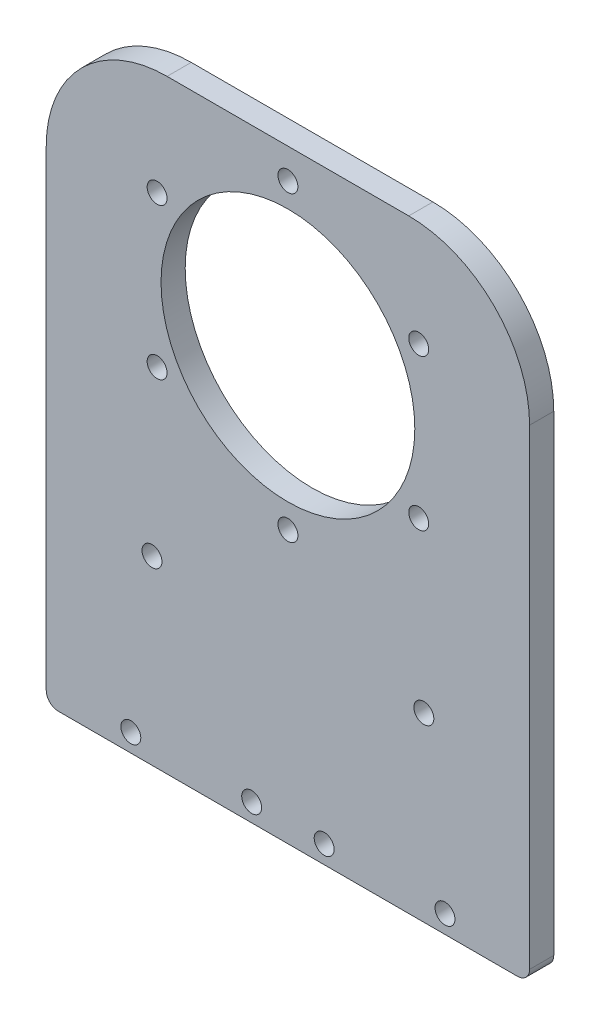
ISO-10303-21;
HEADER;
FILE_DESCRIPTION(('STEP AP214'),'2;1');
FILE_NAME('part.step','',(''),(''),'','','');
FILE_SCHEMA(('AUTOMOTIVE_DESIGN { 1 0 10303 214 1 1 1 1 }'));
ENDSEC;
DATA;
#1=APPLICATION_CONTEXT('core data for automotive mechanical design processes');
#2=APPLICATION_PROTOCOL_DEFINITION('international standard','automotive_design',2000,#1);
#3=PRODUCT_CONTEXT('',#1,'mechanical');
#4=PRODUCT('Part','Part','',(#3));
#5=PRODUCT_RELATED_PRODUCT_CATEGORY('part','',(#4));
#6=PRODUCT_DEFINITION_FORMATION('','',#4);
#7=PRODUCT_DEFINITION_CONTEXT('part definition',#1,'design');
#8=PRODUCT_DEFINITION('design','',#6,#7);
#9=PRODUCT_DEFINITION_SHAPE('','',#8);
#10=(LENGTH_UNIT() NAMED_UNIT(*) SI_UNIT(.MILLI.,.METRE.));
#11=(NAMED_UNIT(*) PLANE_ANGLE_UNIT() SI_UNIT($,.RADIAN.));
#12=(NAMED_UNIT(*) SI_UNIT($,.STERADIAN.) SOLID_ANGLE_UNIT());
#13=UNCERTAINTY_MEASURE_WITH_UNIT(LENGTH_MEASURE(1.E-05),#10,'distance_accuracy_value','');
#14=(GEOMETRIC_REPRESENTATION_CONTEXT(3) GLOBAL_UNCERTAINTY_ASSIGNED_CONTEXT((#13)) GLOBAL_UNIT_ASSIGNED_CONTEXT((#10,
#11,#12)) REPRESENTATION_CONTEXT('',''));
#15=CARTESIAN_POINT('',(0.,0.,0.));
#16=DIRECTION('',(0.,0.,1.));
#17=DIRECTION('',(1.,0.,0.));
#18=AXIS2_PLACEMENT_3D('',#15,#16,#17);
#19=CARTESIAN_POINT('',(0.,0.,4.));
#20=DIRECTION('',(0.,0.,1.));
#21=DIRECTION('',(1.,0.,0.));
#22=AXIS2_PLACEMENT_3D('',#19,#20,#21);
#23=PLANE('',#22);
#24=CARTESIAN_POINT('',(22.5,-20.,4.));
#25=DIRECTION('',(0.,0.,1.));
#26=DIRECTION('',(-1.,0.,0.));
#27=AXIS2_PLACEMENT_3D('',#24,#25,#26);
#28=CIRCLE('',#27,1.65);
#29=CARTESIAN_POINT('',(20.85,-20.,4.));
#30=VERTEX_POINT('',#29);
#31=EDGE_CURVE('E335',#30,#30,#28,.T.);
#32=ORIENTED_EDGE('',*,*,#31,.F.);
#33=EDGE_LOOP('',(#32));
#34=FACE_BOUND('',#33,.T.);
#35=CARTESIAN_POINT('',(-22.5,-20.,4.));
#36=DIRECTION('',(0.,0.,1.));
#37=DIRECTION('',(1.,0.,0.));
#38=AXIS2_PLACEMENT_3D('',#35,#36,#37);
#39=CIRCLE('',#38,1.65);
#40=CARTESIAN_POINT('',(-20.85,-20.,4.));
#41=VERTEX_POINT('',#40);
#42=EDGE_CURVE('E337',#41,#41,#39,.T.);
#43=ORIENTED_EDGE('',*,*,#42,.F.);
#44=EDGE_LOOP('',(#43));
#45=FACE_BOUND('',#44,.T.);
#46=CARTESIAN_POINT('',(-26.,-47.,4.));
#47=DIRECTION('',(0.,0.,1.));
#48=DIRECTION('',(1.,0.,0.));
#49=AXIS2_PLACEMENT_3D('',#46,#47,#48);
#50=CIRCLE('',#49,1.65);
#51=CARTESIAN_POINT('',(-24.35,-47.,4.));
#52=VERTEX_POINT('',#51);
#53=EDGE_CURVE('E358',#52,#52,#50,.T.);
#54=ORIENTED_EDGE('',*,*,#53,.F.);
#55=EDGE_LOOP('',(#54));
#56=FACE_BOUND('',#55,.T.);
#57=CARTESIAN_POINT('',(-6.00000000000001,-47.,4.));
#58=DIRECTION('',(0.,0.,1.));
#59=DIRECTION('',(-1.,0.,0.));
#60=AXIS2_PLACEMENT_3D('',#57,#58,#59);
#61=CIRCLE('',#60,1.65);
#62=CARTESIAN_POINT('',(-7.65000000000001,-47.,4.));
#63=VERTEX_POINT('',#62);
#64=EDGE_CURVE('E363',#63,#63,#61,.T.);
#65=ORIENTED_EDGE('',*,*,#64,.F.);
#66=EDGE_LOOP('',(#65));
#67=FACE_BOUND('',#66,.T.);
#68=CARTESIAN_POINT('',(6.00000000000001,-47.,4.));
#69=DIRECTION('',(0.,0.,1.));
#70=DIRECTION('',(1.,0.,0.));
#71=AXIS2_PLACEMENT_3D('',#68,#69,#70);
#72=CIRCLE('',#71,1.65);
#73=CARTESIAN_POINT('',(7.65000000000001,-47.,4.));
#74=VERTEX_POINT('',#73);
#75=EDGE_CURVE('E374',#74,#74,#72,.T.);
#76=ORIENTED_EDGE('',*,*,#75,.F.);
#77=EDGE_LOOP('',(#76));
#78=FACE_BOUND('',#77,.T.);
#79=CARTESIAN_POINT('',(26.,-47.,4.));
#80=DIRECTION('',(0.,0.,1.));
#81=DIRECTION('',(-1.,0.,0.));
#82=AXIS2_PLACEMENT_3D('',#79,#80,#81);
#83=CIRCLE('',#82,1.65);
#84=CARTESIAN_POINT('',(24.35,-47.,4.));
#85=VERTEX_POINT('',#84);
#86=EDGE_CURVE('E382',#85,#85,#83,.T.);
#87=ORIENTED_EDGE('',*,*,#86,.F.);
#88=EDGE_LOOP('',(#87));
#89=FACE_BOUND('',#88,.T.);
#90=CARTESIAN_POINT('',(0.,20.,4.));
#91=DIRECTION('',(0.,0.,1.));
#92=DIRECTION('',(1.,0.,0.));
#93=AXIS2_PLACEMENT_3D('',#90,#91,#92);
#94=CIRCLE('',#93,21.);
#95=CARTESIAN_POINT('',(21.,20.,4.));
#96=VERTEX_POINT('',#95);
#97=EDGE_CURVE('E357',#96,#96,#94,.T.);
#98=ORIENTED_EDGE('',*,*,#97,.F.);
#99=EDGE_LOOP('',(#98));
#100=FACE_BOUND('',#99,.T.);
#101=CARTESIAN_POINT('',(-21.650635094611,7.49999999999998,4.));
#102=DIRECTION('',(0.,0.,1.));
#103=DIRECTION('',(1.,0.,0.));
#104=AXIS2_PLACEMENT_3D('',#101,#102,#103);
#105=CIRCLE('',#104,1.65);
#106=CARTESIAN_POINT('',(-20.000635094611,7.49999999999998,4.));
#107=VERTEX_POINT('',#106);
#108=EDGE_CURVE('E403',#107,#107,#105,.T.);
#109=ORIENTED_EDGE('',*,*,#108,.F.);
#110=EDGE_LOOP('',(#109));
#111=FACE_BOUND('',#110,.T.);
#112=CARTESIAN_POINT('',(21.650635094611,7.49999999999999,4.));
#113=DIRECTION('',(0.,0.,1.));
#114=DIRECTION('',(1.,0.,0.));
#115=AXIS2_PLACEMENT_3D('',#112,#113,#114);
#116=CIRCLE('',#115,1.65);
#117=CARTESIAN_POINT('',(23.300635094611,7.49999999999999,4.));
#118=VERTEX_POINT('',#117);
#119=EDGE_CURVE('E194',#118,#118,#116,.T.);
#120=ORIENTED_EDGE('',*,*,#119,.F.);
#121=EDGE_LOOP('',(#120));
#122=FACE_BOUND('',#121,.T.);
#123=CARTESIAN_POINT('',(0.,45.,4.));
#124=DIRECTION('',(0.,0.,1.));
#125=DIRECTION('',(1.,0.,0.));
#126=AXIS2_PLACEMENT_3D('',#123,#124,#125);
#127=CIRCLE('',#126,1.65);
#128=CARTESIAN_POINT('',(1.65,45.,4.));
#129=VERTEX_POINT('',#128);
#130=EDGE_CURVE('E141',#129,#129,#127,.T.);
#131=ORIENTED_EDGE('',*,*,#130,.F.);
#132=EDGE_LOOP('',(#131));
#133=FACE_BOUND('',#132,.T.);
#134=DIRECTION('',(0.,1.,0.));
#135=VECTOR('',#134,1.);
#136=CARTESIAN_POINT('',(40.,50.,4.));
#137=LINE('',#136,#135);
#138=CARTESIAN_POINT('',(40.,-48.,4.));
#139=VERTEX_POINT('',#138);
#140=CARTESIAN_POINT('',(40.,30.,4.));
#141=VERTEX_POINT('',#140);
#142=EDGE_CURVE('E131',#139,#141,#137,.T.);
#143=ORIENTED_EDGE('',*,*,#142,.T.);
#144=CARTESIAN_POINT('',(20.,30.,4.));
#145=DIRECTION('',(0.,0.,1.));
#146=DIRECTION('',(1.,0.,0.));
#147=AXIS2_PLACEMENT_3D('',#144,#145,#146);
#148=CIRCLE('',#147,20.);
#149=CARTESIAN_POINT('',(20.,50.,4.));
#150=VERTEX_POINT('',#149);
#151=EDGE_CURVE('E55',#141,#150,#148,.T.);
#152=ORIENTED_EDGE('',*,*,#151,.T.);
#153=DIRECTION('',(-1.,0.,0.));
#154=VECTOR('',#153,1.);
#155=CARTESIAN_POINT('',(-40.,50.,4.));
#156=LINE('',#155,#154);
#157=CARTESIAN_POINT('',(-20.,50.,4.));
#158=VERTEX_POINT('',#157);
#159=EDGE_CURVE('E207',#150,#158,#156,.T.);
#160=ORIENTED_EDGE('',*,*,#159,.T.);
#161=CARTESIAN_POINT('',(-20.,30.,4.));
#162=DIRECTION('',(0.,0.,1.));
#163=DIRECTION('',(1.,0.,0.));
#164=AXIS2_PLACEMENT_3D('',#161,#162,#163);
#165=CIRCLE('',#164,20.);
#166=CARTESIAN_POINT('',(-40.,30.,4.));
#167=VERTEX_POINT('',#166);
#168=EDGE_CURVE('E62',#158,#167,#165,.T.);
#169=ORIENTED_EDGE('',*,*,#168,.T.);
#170=DIRECTION('',(0.,-1.,0.));
#171=VECTOR('',#170,1.);
#172=CARTESIAN_POINT('',(-40.,50.,4.));
#173=LINE('',#172,#171);
#174=CARTESIAN_POINT('',(-40.,-48.,4.));
#175=VERTEX_POINT('',#174);
#176=EDGE_CURVE('E210',#167,#175,#173,.T.);
#177=ORIENTED_EDGE('',*,*,#176,.T.);
#178=CARTESIAN_POINT('',(-38.,-48.,4.));
#179=DIRECTION('',(0.,0.,1.));
#180=DIRECTION('',(1.,0.,0.));
#181=AXIS2_PLACEMENT_3D('',#178,#179,#180);
#182=CIRCLE('',#181,2.);
#183=CARTESIAN_POINT('',(-38.,-50.,4.));
#184=VERTEX_POINT('',#183);
#185=EDGE_CURVE('E168',#175,#184,#182,.T.);
#186=ORIENTED_EDGE('',*,*,#185,.T.);
#187=DIRECTION('',(1.,0.,0.));
#188=VECTOR('',#187,1.);
#189=CARTESIAN_POINT('',(-40.,-50.,4.));
#190=LINE('',#189,#188);
#191=CARTESIAN_POINT('',(38.,-50.,4.));
#192=VERTEX_POINT('',#191);
#193=EDGE_CURVE('E133',#184,#192,#190,.T.);
#194=ORIENTED_EDGE('',*,*,#193,.T.);
#195=CARTESIAN_POINT('',(38.,-48.,4.));
#196=DIRECTION('',(0.,0.,1.));
#197=DIRECTION('',(1.,0.,0.));
#198=AXIS2_PLACEMENT_3D('',#195,#196,#197);
#199=CIRCLE('',#198,2.);
#200=EDGE_CURVE('E172',#192,#139,#199,.T.);
#201=ORIENTED_EDGE('',*,*,#200,.T.);
#202=EDGE_LOOP('',(#143,#152,#160,#169,#177,#186,#194,#201));
#203=FACE_BOUND('',#202,.T.);
#204=CARTESIAN_POINT('',(21.650635094611,32.5,4.));
#205=DIRECTION('',(0.,0.,1.));
#206=DIRECTION('',(1.,0.,0.));
#207=AXIS2_PLACEMENT_3D('',#204,#205,#206);
#208=CIRCLE('',#207,1.65);
#209=CARTESIAN_POINT('',(23.300635094611,32.5,4.));
#210=VERTEX_POINT('',#209);
#211=EDGE_CURVE('E183',#210,#210,#208,.T.);
#212=ORIENTED_EDGE('',*,*,#211,.F.);
#213=EDGE_LOOP('',(#212));
#214=FACE_BOUND('',#213,.T.);
#215=CARTESIAN_POINT('',(0.,-5.00000000000001,4.));
#216=DIRECTION('',(0.,0.,1.));
#217=DIRECTION('',(1.,0.,0.));
#218=AXIS2_PLACEMENT_3D('',#215,#216,#217);
#219=CIRCLE('',#218,1.65);
#220=CARTESIAN_POINT('',(1.65,-5.00000000000001,4.));
#221=VERTEX_POINT('',#220);
#222=EDGE_CURVE('E412',#221,#221,#219,.T.);
#223=ORIENTED_EDGE('',*,*,#222,.F.);
#224=EDGE_LOOP('',(#223));
#225=FACE_BOUND('',#224,.T.);
#226=CARTESIAN_POINT('',(-21.650635094611,32.5,4.));
#227=DIRECTION('',(0.,0.,1.));
#228=DIRECTION('',(1.,0.,0.));
#229=AXIS2_PLACEMENT_3D('',#226,#227,#228);
#230=CIRCLE('',#229,1.65);
#231=CARTESIAN_POINT('',(-20.000635094611,32.5,4.));
#232=VERTEX_POINT('',#231);
#233=EDGE_CURVE('E399',#232,#232,#230,.T.);
#234=ORIENTED_EDGE('',*,*,#233,.F.);
#235=EDGE_LOOP('',(#234));
#236=FACE_BOUND('',#235,.T.);
#237=ADVANCED_FACE('F46',(#34,#45,#56,#67,#78,#89,#100,#111,#122,#133,#203,#214,#225,#236),#23,.T.);
#238=CARTESIAN_POINT('',(0.,0.,0.));
#239=DIRECTION('',(0.,0.,1.));
#240=DIRECTION('',(1.,0.,0.));
#241=AXIS2_PLACEMENT_3D('',#238,#239,#240);
#242=PLANE('',#241);
#243=CARTESIAN_POINT('',(22.5,-20.,0.));
#244=DIRECTION('',(0.,0.,1.));
#245=DIRECTION('',(-1.,0.,0.));
#246=AXIS2_PLACEMENT_3D('',#243,#244,#245);
#247=CIRCLE('',#246,1.65);
#248=CARTESIAN_POINT('',(20.85,-20.,0.));
#249=VERTEX_POINT('',#248);
#250=EDGE_CURVE('E333',#249,#249,#247,.T.);
#251=ORIENTED_EDGE('',*,*,#250,.T.);
#252=EDGE_LOOP('',(#251));
#253=FACE_BOUND('',#252,.T.);
#254=CARTESIAN_POINT('',(-22.5,-20.,0.));
#255=DIRECTION('',(0.,0.,1.));
#256=DIRECTION('',(1.,0.,0.));
#257=AXIS2_PLACEMENT_3D('',#254,#255,#256);
#258=CIRCLE('',#257,1.65);
#259=CARTESIAN_POINT('',(-20.85,-20.,0.));
#260=VERTEX_POINT('',#259);
#261=EDGE_CURVE('E342',#260,#260,#258,.T.);
#262=ORIENTED_EDGE('',*,*,#261,.T.);
#263=EDGE_LOOP('',(#262));
#264=FACE_BOUND('',#263,.T.);
#265=CARTESIAN_POINT('',(-26.,-47.,0.));
#266=DIRECTION('',(0.,0.,1.));
#267=DIRECTION('',(1.,0.,0.));
#268=AXIS2_PLACEMENT_3D('',#265,#266,#267);
#269=CIRCLE('',#268,1.65);
#270=CARTESIAN_POINT('',(-24.35,-47.,0.));
#271=VERTEX_POINT('',#270);
#272=EDGE_CURVE('E354',#271,#271,#269,.T.);
#273=ORIENTED_EDGE('',*,*,#272,.T.);
#274=EDGE_LOOP('',(#273));
#275=FACE_BOUND('',#274,.T.);
#276=CARTESIAN_POINT('',(-6.00000000000001,-47.,0.));
#277=DIRECTION('',(0.,0.,1.));
#278=DIRECTION('',(-1.,0.,0.));
#279=AXIS2_PLACEMENT_3D('',#276,#277,#278);
#280=CIRCLE('',#279,1.65);
#281=CARTESIAN_POINT('',(-7.65000000000001,-47.,0.));
#282=VERTEX_POINT('',#281);
#283=EDGE_CURVE('E368',#282,#282,#280,.T.);
#284=ORIENTED_EDGE('',*,*,#283,.T.);
#285=EDGE_LOOP('',(#284));
#286=FACE_BOUND('',#285,.T.);
#287=CARTESIAN_POINT('',(6.00000000000001,-47.,0.));
#288=DIRECTION('',(0.,0.,1.));
#289=DIRECTION('',(1.,0.,0.));
#290=AXIS2_PLACEMENT_3D('',#287,#288,#289);
#291=CIRCLE('',#290,1.65);
#292=CARTESIAN_POINT('',(7.65000000000001,-47.,0.));
#293=VERTEX_POINT('',#292);
#294=EDGE_CURVE('E379',#293,#293,#291,.T.);
#295=ORIENTED_EDGE('',*,*,#294,.T.);
#296=EDGE_LOOP('',(#295));
#297=FACE_BOUND('',#296,.T.);
#298=CARTESIAN_POINT('',(26.,-47.,0.));
#299=DIRECTION('',(0.,0.,1.));
#300=DIRECTION('',(-1.,0.,0.));
#301=AXIS2_PLACEMENT_3D('',#298,#299,#300);
#302=CIRCLE('',#301,1.65);
#303=CARTESIAN_POINT('',(24.35,-47.,0.));
#304=VERTEX_POINT('',#303);
#305=EDGE_CURVE('E387',#304,#304,#302,.T.);
#306=ORIENTED_EDGE('',*,*,#305,.T.);
#307=EDGE_LOOP('',(#306));
#308=FACE_BOUND('',#307,.T.);
#309=CARTESIAN_POINT('',(0.,20.,0.));
#310=DIRECTION('',(0.,0.,1.));
#311=DIRECTION('',(1.,0.,0.));
#312=AXIS2_PLACEMENT_3D('',#309,#310,#311);
#313=CIRCLE('',#312,21.);
#314=CARTESIAN_POINT('',(21.,20.,0.));
#315=VERTEX_POINT('',#314);
#316=EDGE_CURVE('E391',#315,#315,#313,.T.);
#317=ORIENTED_EDGE('',*,*,#316,.T.);
#318=EDGE_LOOP('',(#317));
#319=FACE_BOUND('',#318,.T.);
#320=DIRECTION('',(-1.,0.,0.));
#321=VECTOR('',#320,1.);
#322=CARTESIAN_POINT('',(-40.,50.,0.));
#323=LINE('',#322,#321);
#324=CARTESIAN_POINT('',(20.,50.,0.));
#325=VERTEX_POINT('',#324);
#326=CARTESIAN_POINT('',(-20.,50.,0.));
#327=VERTEX_POINT('',#326);
#328=EDGE_CURVE('E140',#325,#327,#323,.T.);
#329=ORIENTED_EDGE('',*,*,#328,.F.);
#330=CARTESIAN_POINT('',(20.,30.,0.));
#331=DIRECTION('',(0.,0.,1.));
#332=DIRECTION('',(1.,0.,0.));
#333=AXIS2_PLACEMENT_3D('',#330,#331,#332);
#334=CIRCLE('',#333,20.);
#335=CARTESIAN_POINT('',(40.,30.,0.));
#336=VERTEX_POINT('',#335);
#337=EDGE_CURVE('E138',#325,#336,#334,.F.);
#338=ORIENTED_EDGE('',*,*,#337,.T.);
#339=DIRECTION('',(0.,1.,0.));
#340=VECTOR('',#339,1.);
#341=CARTESIAN_POINT('',(40.,50.,0.));
#342=LINE('',#341,#340);
#343=CARTESIAN_POINT('',(40.,-48.,0.));
#344=VERTEX_POINT('',#343);
#345=EDGE_CURVE('E130',#344,#336,#342,.T.);
#346=ORIENTED_EDGE('',*,*,#345,.F.);
#347=CARTESIAN_POINT('',(38.,-48.,0.));
#348=DIRECTION('',(0.,0.,1.));
#349=DIRECTION('',(1.,0.,0.));
#350=AXIS2_PLACEMENT_3D('',#347,#348,#349);
#351=CIRCLE('',#350,2.);
#352=CARTESIAN_POINT('',(38.,-50.,0.));
#353=VERTEX_POINT('',#352);
#354=EDGE_CURVE('E115',#344,#353,#351,.F.);
#355=ORIENTED_EDGE('',*,*,#354,.T.);
#356=DIRECTION('',(1.,0.,0.));
#357=VECTOR('',#356,1.);
#358=CARTESIAN_POINT('',(-40.,-50.,0.));
#359=LINE('',#358,#357);
#360=CARTESIAN_POINT('',(-38.,-50.,0.));
#361=VERTEX_POINT('',#360);
#362=EDGE_CURVE('E157',#361,#353,#359,.T.);
#363=ORIENTED_EDGE('',*,*,#362,.F.);
#364=CARTESIAN_POINT('',(-38.,-48.,0.));
#365=DIRECTION('',(0.,0.,1.));
#366=DIRECTION('',(1.,0.,0.));
#367=AXIS2_PLACEMENT_3D('',#364,#365,#366);
#368=CIRCLE('',#367,2.);
#369=CARTESIAN_POINT('',(-40.,-48.,0.));
#370=VERTEX_POINT('',#369);
#371=EDGE_CURVE('E127',#361,#370,#368,.F.);
#372=ORIENTED_EDGE('',*,*,#371,.T.);
#373=DIRECTION('',(0.,-1.,0.));
#374=VECTOR('',#373,1.);
#375=CARTESIAN_POINT('',(-40.,50.,0.));
#376=LINE('',#375,#374);
#377=CARTESIAN_POINT('',(-40.,30.,0.));
#378=VERTEX_POINT('',#377);
#379=EDGE_CURVE('E146',#378,#370,#376,.T.);
#380=ORIENTED_EDGE('',*,*,#379,.F.);
#381=CARTESIAN_POINT('',(-20.,30.,0.));
#382=DIRECTION('',(0.,0.,1.));
#383=DIRECTION('',(1.,0.,0.));
#384=AXIS2_PLACEMENT_3D('',#381,#382,#383);
#385=CIRCLE('',#384,20.);
#386=EDGE_CURVE('E232',#378,#327,#385,.F.);
#387=ORIENTED_EDGE('',*,*,#386,.T.);
#388=EDGE_LOOP('',(#329,#338,#346,#355,#363,#372,#380,#387));
#389=FACE_BOUND('',#388,.T.);
#390=CARTESIAN_POINT('',(0.,45.,0.));
#391=DIRECTION('',(0.,0.,1.));
#392=DIRECTION('',(1.,0.,0.));
#393=AXIS2_PLACEMENT_3D('',#390,#391,#392);
#394=CIRCLE('',#393,1.65);
#395=CARTESIAN_POINT('',(1.65,45.,0.));
#396=VERTEX_POINT('',#395);
#397=EDGE_CURVE('E149',#396,#396,#394,.T.);
#398=ORIENTED_EDGE('',*,*,#397,.T.);
#399=EDGE_LOOP('',(#398));
#400=FACE_BOUND('',#399,.T.);
#401=CARTESIAN_POINT('',(21.650635094611,32.5,0.));
#402=DIRECTION('',(0.,0.,1.));
#403=DIRECTION('',(1.,0.,0.));
#404=AXIS2_PLACEMENT_3D('',#401,#402,#403);
#405=CIRCLE('',#404,1.65);
#406=CARTESIAN_POINT('',(23.300635094611,32.5,0.));
#407=VERTEX_POINT('',#406);
#408=EDGE_CURVE('E189',#407,#407,#405,.T.);
#409=ORIENTED_EDGE('',*,*,#408,.T.);
#410=EDGE_LOOP('',(#409));
#411=FACE_BOUND('',#410,.T.);
#412=CARTESIAN_POINT('',(21.650635094611,7.49999999999999,0.));
#413=DIRECTION('',(0.,0.,1.));
#414=DIRECTION('',(1.,0.,0.));
#415=AXIS2_PLACEMENT_3D('',#412,#413,#414);
#416=CIRCLE('',#415,1.65);
#417=CARTESIAN_POINT('',(23.300635094611,7.49999999999999,0.));
#418=VERTEX_POINT('',#417);
#419=EDGE_CURVE('E190',#418,#418,#416,.T.);
#420=ORIENTED_EDGE('',*,*,#419,.T.);
#421=EDGE_LOOP('',(#420));
#422=FACE_BOUND('',#421,.T.);
#423=CARTESIAN_POINT('',(0.,-5.00000000000001,0.));
#424=DIRECTION('',(0.,0.,1.));
#425=DIRECTION('',(1.,0.,0.));
#426=AXIS2_PLACEMENT_3D('',#423,#424,#425);
#427=CIRCLE('',#426,1.65);
#428=CARTESIAN_POINT('',(1.65,-5.00000000000001,0.));
#429=VERTEX_POINT('',#428);
#430=EDGE_CURVE('E408',#429,#429,#427,.T.);
#431=ORIENTED_EDGE('',*,*,#430,.T.);
#432=EDGE_LOOP('',(#431));
#433=FACE_BOUND('',#432,.T.);
#434=CARTESIAN_POINT('',(-21.650635094611,7.49999999999998,0.));
#435=DIRECTION('',(0.,0.,1.));
#436=DIRECTION('',(1.,0.,0.));
#437=AXIS2_PLACEMENT_3D('',#434,#435,#436);
#438=CIRCLE('',#437,1.65);
#439=CARTESIAN_POINT('',(-20.000635094611,7.49999999999998,0.));
#440=VERTEX_POINT('',#439);
#441=EDGE_CURVE('E409',#440,#440,#438,.T.);
#442=ORIENTED_EDGE('',*,*,#441,.T.);
#443=EDGE_LOOP('',(#442));
#444=FACE_BOUND('',#443,.T.);
#445=CARTESIAN_POINT('',(-21.650635094611,32.5,0.));
#446=DIRECTION('',(0.,0.,1.));
#447=DIRECTION('',(1.,0.,0.));
#448=AXIS2_PLACEMENT_3D('',#445,#446,#447);
#449=CIRCLE('',#448,1.65);
#450=CARTESIAN_POINT('',(-20.000635094611,32.5,0.));
#451=VERTEX_POINT('',#450);
#452=EDGE_CURVE('E395',#451,#451,#449,.T.);
#453=ORIENTED_EDGE('',*,*,#452,.T.);
#454=EDGE_LOOP('',(#453));
#455=FACE_BOUND('',#454,.T.);
#456=ADVANCED_FACE('F136',(#253,#264,#275,#286,#297,#308,#319,#389,#400,#411,#422,#433,#444,
#455),#242,.F.);
#457=CARTESIAN_POINT('',(40.,50.,4.));
#458=DIRECTION('',(-1.,0.,0.));
#459=DIRECTION('',(0.,-1.,0.));
#460=AXIS2_PLACEMENT_3D('',#457,#458,#459);
#461=PLANE('',#460);
#462=ORIENTED_EDGE('',*,*,#345,.T.);
#463=DIRECTION('',(0.,0.,-1.));
#464=VECTOR('',#463,1.);
#465=CARTESIAN_POINT('',(40.,30.,4.));
#466=LINE('',#465,#464);
#467=EDGE_CURVE('E70',#336,#141,#466,.F.);
#468=ORIENTED_EDGE('',*,*,#467,.T.);
#469=ORIENTED_EDGE('',*,*,#142,.F.);
#470=DIRECTION('',(0.,0.,-1.));
#471=VECTOR('',#470,1.);
#472=CARTESIAN_POINT('',(40.,-48.,4.));
#473=LINE('',#472,#471);
#474=EDGE_CURVE('E119',#139,#344,#473,.T.);
#475=ORIENTED_EDGE('',*,*,#474,.T.);
#476=EDGE_LOOP('',(#462,#468,#469,#475));
#477=FACE_BOUND('',#476,.T.);
#478=ADVANCED_FACE('F129',(#477),#461,.F.);
#479=CARTESIAN_POINT('',(-40.,50.,4.));
#480=DIRECTION('',(0.,-1.,0.));
#481=DIRECTION('',(0.,0.,-1.));
#482=AXIS2_PLACEMENT_3D('',#479,#480,#481);
#483=PLANE('',#482);
#484=ORIENTED_EDGE('',*,*,#159,.F.);
#485=DIRECTION('',(0.,0.,-1.));
#486=VECTOR('',#485,1.);
#487=CARTESIAN_POINT('',(20.,50.,4.));
#488=LINE('',#487,#486);
#489=EDGE_CURVE('E227',#150,#325,#488,.T.);
#490=ORIENTED_EDGE('',*,*,#489,.T.);
#491=ORIENTED_EDGE('',*,*,#328,.T.);
#492=DIRECTION('',(0.,0.,-1.));
#493=VECTOR('',#492,1.);
#494=CARTESIAN_POINT('',(-20.,50.,4.));
#495=LINE('',#494,#493);
#496=EDGE_CURVE('E229',#327,#158,#495,.F.);
#497=ORIENTED_EDGE('',*,*,#496,.T.);
#498=EDGE_LOOP('',(#484,#490,#491,#497));
#499=FACE_BOUND('',#498,.T.);
#500=ADVANCED_FACE('F226',(#499),#483,.F.);
#501=CARTESIAN_POINT('',(-40.,50.,4.));
#502=DIRECTION('',(1.,0.,0.));
#503=DIRECTION('',(0.,1.,0.));
#504=AXIS2_PLACEMENT_3D('',#501,#502,#503);
#505=PLANE('',#504);
#506=ORIENTED_EDGE('',*,*,#176,.F.);
#507=DIRECTION('',(0.,0.,-1.));
#508=VECTOR('',#507,1.);
#509=CARTESIAN_POINT('',(-40.,30.,4.));
#510=LINE('',#509,#508);
#511=EDGE_CURVE('E12',#167,#378,#510,.T.);
#512=ORIENTED_EDGE('',*,*,#511,.T.);
#513=ORIENTED_EDGE('',*,*,#379,.T.);
#514=DIRECTION('',(0.,0.,-1.));
#515=VECTOR('',#514,1.);
#516=CARTESIAN_POINT('',(-40.,-48.,4.));
#517=LINE('',#516,#515);
#518=EDGE_CURVE('E237',#370,#175,#517,.F.);
#519=ORIENTED_EDGE('',*,*,#518,.T.);
#520=EDGE_LOOP('',(#506,#512,#513,#519));
#521=FACE_BOUND('',#520,.T.);
#522=ADVANCED_FACE('F254',(#521),#505,.F.);
#523=CARTESIAN_POINT('',(-40.,-50.,4.));
#524=DIRECTION('',(0.,1.,0.));
#525=DIRECTION('',(0.,0.,1.));
#526=AXIS2_PLACEMENT_3D('',#523,#524,#525);
#527=PLANE('',#526);
#528=ORIENTED_EDGE('',*,*,#362,.T.);
#529=DIRECTION('',(0.,0.,-1.));
#530=VECTOR('',#529,1.);
#531=CARTESIAN_POINT('',(38.,-50.,4.));
#532=LINE('',#531,#530);
#533=EDGE_CURVE('E120',#353,#192,#532,.F.);
#534=ORIENTED_EDGE('',*,*,#533,.T.);
#535=ORIENTED_EDGE('',*,*,#193,.F.);
#536=DIRECTION('',(0.,0.,-1.));
#537=VECTOR('',#536,1.);
#538=CARTESIAN_POINT('',(-38.,-50.,4.));
#539=LINE('',#538,#537);
#540=EDGE_CURVE('E126',#184,#361,#539,.T.);
#541=ORIENTED_EDGE('',*,*,#540,.T.);
#542=EDGE_LOOP('',(#528,#534,#535,#541));
#543=FACE_BOUND('',#542,.T.);
#544=ADVANCED_FACE('F259',(#543),#527,.F.);
#545=CARTESIAN_POINT('',(0.,45.,4.));
#546=DIRECTION('',(0.,0.,-1.));
#547=DIRECTION('',(-1.,0.,0.));
#548=AXIS2_PLACEMENT_3D('',#545,#546,#547);
#549=CYLINDRICAL_SURFACE('',#548,1.65);
#550=ORIENTED_EDGE('',*,*,#130,.T.);
#551=EDGE_LOOP('',(#550));
#552=FACE_BOUND('',#551,.T.);
#553=ORIENTED_EDGE('',*,*,#397,.F.);
#554=EDGE_LOOP('',(#553));
#555=FACE_BOUND('',#554,.T.);
#556=ADVANCED_FACE('F261',(#552,#555),#549,.F.);
#557=CARTESIAN_POINT('',(21.650635094611,32.5,4.));
#558=DIRECTION('',(0.,0.,-1.));
#559=DIRECTION('',(-1.,0.,0.));
#560=AXIS2_PLACEMENT_3D('',#557,#558,#559);
#561=CYLINDRICAL_SURFACE('',#560,1.65);
#562=ORIENTED_EDGE('',*,*,#211,.T.);
#563=EDGE_LOOP('',(#562));
#564=FACE_BOUND('',#563,.T.);
#565=ORIENTED_EDGE('',*,*,#408,.F.);
#566=EDGE_LOOP('',(#565));
#567=FACE_BOUND('',#566,.T.);
#568=ADVANCED_FACE('F267',(#564,#567),#561,.F.);
#569=CARTESIAN_POINT('',(21.650635094611,7.49999999999999,4.));
#570=DIRECTION('',(0.,0.,-1.));
#571=DIRECTION('',(-1.,0.,0.));
#572=AXIS2_PLACEMENT_3D('',#569,#570,#571);
#573=CYLINDRICAL_SURFACE('',#572,1.65);
#574=ORIENTED_EDGE('',*,*,#119,.T.);
#575=EDGE_LOOP('',(#574));
#576=FACE_BOUND('',#575,.T.);
#577=ORIENTED_EDGE('',*,*,#419,.F.);
#578=EDGE_LOOP('',(#577));
#579=FACE_BOUND('',#578,.T.);
#580=ADVANCED_FACE('F284',(#576,#579),#573,.F.);
#581=CARTESIAN_POINT('',(0.,-5.00000000000001,4.));
#582=DIRECTION('',(0.,0.,-1.));
#583=DIRECTION('',(-1.,0.,0.));
#584=AXIS2_PLACEMENT_3D('',#581,#582,#583);
#585=CYLINDRICAL_SURFACE('',#584,1.65);
#586=ORIENTED_EDGE('',*,*,#222,.T.);
#587=EDGE_LOOP('',(#586));
#588=FACE_BOUND('',#587,.T.);
#589=ORIENTED_EDGE('',*,*,#430,.F.);
#590=EDGE_LOOP('',(#589));
#591=FACE_BOUND('',#590,.T.);
#592=ADVANCED_FACE('F288',(#588,#591),#585,.F.);
#593=CARTESIAN_POINT('',(-21.650635094611,7.49999999999998,4.));
#594=DIRECTION('',(0.,0.,-1.));
#595=DIRECTION('',(-1.,0.,0.));
#596=AXIS2_PLACEMENT_3D('',#593,#594,#595);
#597=CYLINDRICAL_SURFACE('',#596,1.65);
#598=ORIENTED_EDGE('',*,*,#108,.T.);
#599=EDGE_LOOP('',(#598));
#600=FACE_BOUND('',#599,.T.);
#601=ORIENTED_EDGE('',*,*,#441,.F.);
#602=EDGE_LOOP('',(#601));
#603=FACE_BOUND('',#602,.T.);
#604=ADVANCED_FACE('F292',(#600,#603),#597,.F.);
#605=CARTESIAN_POINT('',(-21.650635094611,32.5,4.));
#606=DIRECTION('',(0.,0.,-1.));
#607=DIRECTION('',(-1.,0.,0.));
#608=AXIS2_PLACEMENT_3D('',#605,#606,#607);
#609=CYLINDRICAL_SURFACE('',#608,1.65);
#610=ORIENTED_EDGE('',*,*,#233,.T.);
#611=EDGE_LOOP('',(#610));
#612=FACE_BOUND('',#611,.T.);
#613=ORIENTED_EDGE('',*,*,#452,.F.);
#614=EDGE_LOOP('',(#613));
#615=FACE_BOUND('',#614,.T.);
#616=ADVANCED_FACE('F296',(#612,#615),#609,.F.);
#617=CARTESIAN_POINT('',(0.,20.,0.));
#618=DIRECTION('',(0.,0.,1.));
#619=DIRECTION('',(1.,0.,0.));
#620=AXIS2_PLACEMENT_3D('',#617,#618,#619);
#621=CYLINDRICAL_SURFACE('',#620,21.);
#622=ORIENTED_EDGE('',*,*,#316,.F.);
#623=EDGE_LOOP('',(#622));
#624=FACE_BOUND('',#623,.T.);
#625=ORIENTED_EDGE('',*,*,#97,.T.);
#626=EDGE_LOOP('',(#625));
#627=FACE_BOUND('',#626,.T.);
#628=ADVANCED_FACE('F300',(#624,#627),#621,.F.);
#629=CARTESIAN_POINT('',(38.,-48.,4.));
#630=DIRECTION('',(0.,0.,-1.));
#631=DIRECTION('',(-1.,0.,0.));
#632=AXIS2_PLACEMENT_3D('',#629,#630,#631);
#633=CYLINDRICAL_SURFACE('',#632,2.);
#634=ORIENTED_EDGE('',*,*,#200,.F.);
#635=ORIENTED_EDGE('',*,*,#533,.F.);
#636=ORIENTED_EDGE('',*,*,#354,.F.);
#637=ORIENTED_EDGE('',*,*,#474,.F.);
#638=EDGE_LOOP('',(#634,#635,#636,#637));
#639=FACE_BOUND('',#638,.T.);
#640=ADVANCED_FACE('F118',(#639),#633,.T.);
#641=CARTESIAN_POINT('',(-38.,-48.,4.));
#642=DIRECTION('',(0.,0.,-1.));
#643=DIRECTION('',(-1.,0.,0.));
#644=AXIS2_PLACEMENT_3D('',#641,#642,#643);
#645=CYLINDRICAL_SURFACE('',#644,2.);
#646=ORIENTED_EDGE('',*,*,#185,.F.);
#647=ORIENTED_EDGE('',*,*,#518,.F.);
#648=ORIENTED_EDGE('',*,*,#371,.F.);
#649=ORIENTED_EDGE('',*,*,#540,.F.);
#650=EDGE_LOOP('',(#646,#647,#648,#649));
#651=FACE_BOUND('',#650,.T.);
#652=ADVANCED_FACE('F258',(#651),#645,.T.);
#653=CARTESIAN_POINT('',(26.,-47.,0.));
#654=DIRECTION('',(0.,0.,1.));
#655=DIRECTION('',(1.,0.,0.));
#656=AXIS2_PLACEMENT_3D('',#653,#654,#655);
#657=CYLINDRICAL_SURFACE('',#656,1.65);
#658=ORIENTED_EDGE('',*,*,#305,.F.);
#659=EDGE_LOOP('',(#658));
#660=FACE_BOUND('',#659,.T.);
#661=ORIENTED_EDGE('',*,*,#86,.T.);
#662=EDGE_LOOP('',(#661));
#663=FACE_BOUND('',#662,.T.);
#664=ADVANCED_FACE('F305',(#660,#663),#657,.F.);
#665=CARTESIAN_POINT('',(6.00000000000001,-47.,0.));
#666=DIRECTION('',(0.,0.,1.));
#667=DIRECTION('',(1.,0.,0.));
#668=AXIS2_PLACEMENT_3D('',#665,#666,#667);
#669=CYLINDRICAL_SURFACE('',#668,1.65);
#670=ORIENTED_EDGE('',*,*,#294,.F.);
#671=EDGE_LOOP('',(#670));
#672=FACE_BOUND('',#671,.T.);
#673=ORIENTED_EDGE('',*,*,#75,.T.);
#674=EDGE_LOOP('',(#673));
#675=FACE_BOUND('',#674,.T.);
#676=ADVANCED_FACE('F308',(#672,#675),#669,.F.);
#677=CARTESIAN_POINT('',(-6.00000000000001,-47.,0.));
#678=DIRECTION('',(0.,0.,1.));
#679=DIRECTION('',(1.,0.,0.));
#680=AXIS2_PLACEMENT_3D('',#677,#678,#679);
#681=CYLINDRICAL_SURFACE('',#680,1.65);
#682=ORIENTED_EDGE('',*,*,#283,.F.);
#683=EDGE_LOOP('',(#682));
#684=FACE_BOUND('',#683,.T.);
#685=ORIENTED_EDGE('',*,*,#64,.T.);
#686=EDGE_LOOP('',(#685));
#687=FACE_BOUND('',#686,.T.);
#688=ADVANCED_FACE('F312',(#684,#687),#681,.F.);
#689=CARTESIAN_POINT('',(-26.,-47.,0.));
#690=DIRECTION('',(0.,0.,1.));
#691=DIRECTION('',(1.,0.,0.));
#692=AXIS2_PLACEMENT_3D('',#689,#690,#691);
#693=CYLINDRICAL_SURFACE('',#692,1.65);
#694=ORIENTED_EDGE('',*,*,#272,.F.);
#695=EDGE_LOOP('',(#694));
#696=FACE_BOUND('',#695,.T.);
#697=ORIENTED_EDGE('',*,*,#53,.T.);
#698=EDGE_LOOP('',(#697));
#699=FACE_BOUND('',#698,.T.);
#700=ADVANCED_FACE('F316',(#696,#699),#693,.F.);
#701=CARTESIAN_POINT('',(20.,30.,4.));
#702=DIRECTION('',(0.,0.,-1.));
#703=DIRECTION('',(-1.,0.,0.));
#704=AXIS2_PLACEMENT_3D('',#701,#702,#703);
#705=CYLINDRICAL_SURFACE('',#704,20.);
#706=ORIENTED_EDGE('',*,*,#151,.F.);
#707=ORIENTED_EDGE('',*,*,#467,.F.);
#708=ORIENTED_EDGE('',*,*,#337,.F.);
#709=ORIENTED_EDGE('',*,*,#489,.F.);
#710=EDGE_LOOP('',(#706,#707,#708,#709));
#711=FACE_BOUND('',#710,.T.);
#712=ADVANCED_FACE('F230',(#711),#705,.T.);
#713=CARTESIAN_POINT('',(-20.,30.,4.));
#714=DIRECTION('',(0.,0.,-1.));
#715=DIRECTION('',(-1.,0.,0.));
#716=AXIS2_PLACEMENT_3D('',#713,#714,#715);
#717=CYLINDRICAL_SURFACE('',#716,20.);
#718=ORIENTED_EDGE('',*,*,#168,.F.);
#719=ORIENTED_EDGE('',*,*,#496,.F.);
#720=ORIENTED_EDGE('',*,*,#386,.F.);
#721=ORIENTED_EDGE('',*,*,#511,.F.);
#722=EDGE_LOOP('',(#718,#719,#720,#721));
#723=FACE_BOUND('',#722,.T.);
#724=ADVANCED_FACE('F48',(#723),#717,.T.);
#725=CARTESIAN_POINT('',(-22.5,-20.,0.));
#726=DIRECTION('',(0.,0.,1.));
#727=DIRECTION('',(1.,0.,0.));
#728=AXIS2_PLACEMENT_3D('',#725,#726,#727);
#729=CYLINDRICAL_SURFACE('',#728,1.65);
#730=ORIENTED_EDGE('',*,*,#261,.F.);
#731=EDGE_LOOP('',(#730));
#732=FACE_BOUND('',#731,.T.);
#733=ORIENTED_EDGE('',*,*,#42,.T.);
#734=EDGE_LOOP('',(#733));
#735=FACE_BOUND('',#734,.T.);
#736=ADVANCED_FACE('F321',(#732,#735),#729,.F.);
#737=CARTESIAN_POINT('',(22.5,-20.,0.));
#738=DIRECTION('',(0.,0.,1.));
#739=DIRECTION('',(1.,0.,0.));
#740=AXIS2_PLACEMENT_3D('',#737,#738,#739);
#741=CYLINDRICAL_SURFACE('',#740,1.65);
#742=ORIENTED_EDGE('',*,*,#250,.F.);
#743=EDGE_LOOP('',(#742));
#744=FACE_BOUND('',#743,.T.);
#745=ORIENTED_EDGE('',*,*,#31,.T.);
#746=EDGE_LOOP('',(#745));
#747=FACE_BOUND('',#746,.T.);
#748=ADVANCED_FACE('F324',(#744,#747),#741,.F.);
#749=CLOSED_SHELL('',(#237,#456,#478,#500,#522,#544,#556,#568,#580,#592,#604,#616,#628,#640,
#652,#664,#676,#688,#700,#712,#724,#736,#748));
#750=MANIFOLD_SOLID_BREP('B2',#749);
#751=ADVANCED_BREP_SHAPE_REPRESENTATION('',(#18,#750),#14);
#752=SHAPE_DEFINITION_REPRESENTATION(#9,#751);
ENDSEC;
END-ISO-10303-21;
